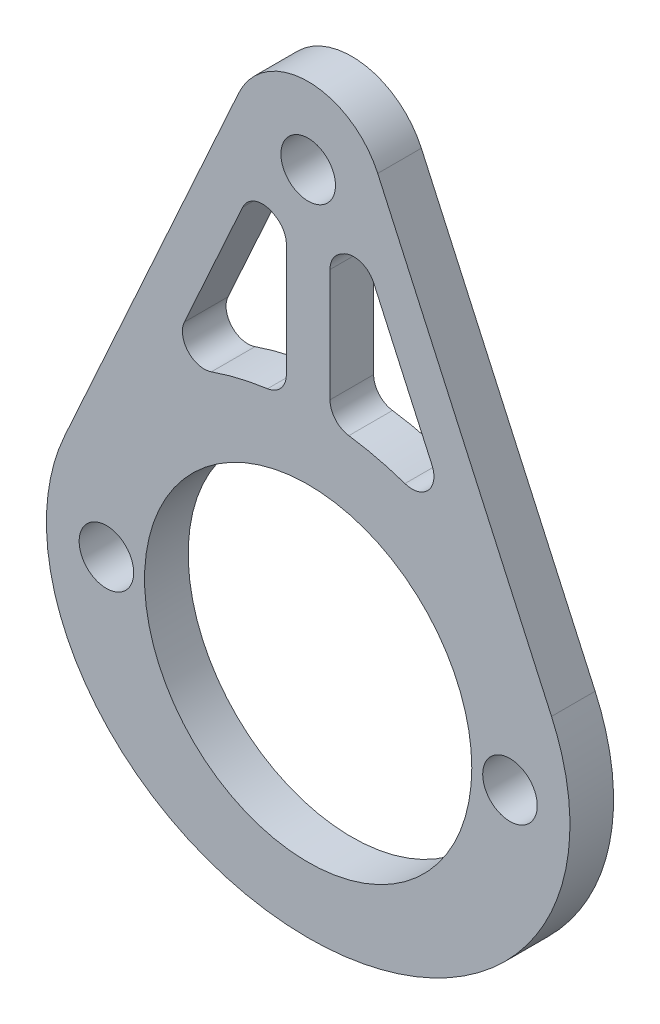
ISO-10303-21;
HEADER;
FILE_DESCRIPTION(('STEP AP214'),'2;1');
FILE_NAME('part.step','',(''),(''),'','','');
FILE_SCHEMA(('AUTOMOTIVE_DESIGN { 1 0 10303 214 1 1 1 1 }'));
ENDSEC;
DATA;
#1=APPLICATION_CONTEXT('core data for automotive mechanical design processes');
#2=APPLICATION_PROTOCOL_DEFINITION('international standard','automotive_design',2000,#1);
#3=PRODUCT_CONTEXT('',#1,'mechanical');
#4=PRODUCT('Part','Part','',(#3));
#5=PRODUCT_RELATED_PRODUCT_CATEGORY('part','',(#4));
#6=PRODUCT_DEFINITION_FORMATION('','',#4);
#7=PRODUCT_DEFINITION_CONTEXT('part definition',#1,'design');
#8=PRODUCT_DEFINITION('design','',#6,#7);
#9=PRODUCT_DEFINITION_SHAPE('','',#8);
#10=(LENGTH_UNIT() NAMED_UNIT(*) SI_UNIT(.MILLI.,.METRE.));
#11=(NAMED_UNIT(*) PLANE_ANGLE_UNIT() SI_UNIT($,.RADIAN.));
#12=(NAMED_UNIT(*) SI_UNIT($,.STERADIAN.) SOLID_ANGLE_UNIT());
#13=UNCERTAINTY_MEASURE_WITH_UNIT(LENGTH_MEASURE(1.E-05),#10,'distance_accuracy_value','');
#14=(GEOMETRIC_REPRESENTATION_CONTEXT(3) GLOBAL_UNCERTAINTY_ASSIGNED_CONTEXT((#13)) GLOBAL_UNIT_ASSIGNED_CONTEXT((#10,
#11,#12)) REPRESENTATION_CONTEXT('',''));
#15=CARTESIAN_POINT('',(0.,0.,0.));
#16=DIRECTION('',(0.,0.,1.));
#17=DIRECTION('',(1.,0.,0.));
#18=AXIS2_PLACEMENT_3D('',#15,#16,#17);
#19=CARTESIAN_POINT('',(0.,0.,2.));
#20=DIRECTION('',(0.,0.,1.));
#21=DIRECTION('',(1.,0.,0.));
#22=AXIS2_PLACEMENT_3D('',#19,#20,#21);
#23=PLANE('',#22);
#24=CARTESIAN_POINT('',(0.,20.,2.));
#25=DIRECTION('',(0.,0.,1.));
#26=DIRECTION('',(1.,0.,0.));
#27=AXIS2_PLACEMENT_3D('',#24,#25,#26);
#28=CIRCLE('',#27,1.24999999999999);
#29=CARTESIAN_POINT('',(1.24999999999999,20.,2.));
#30=VERTEX_POINT('',#29);
#31=EDGE_CURVE('E593',#30,#30,#28,.T.);
#32=ORIENTED_EDGE('',*,*,#31,.F.);
#33=EDGE_LOOP('',(#32));
#34=FACE_BOUND('',#33,.T.);
#35=CARTESIAN_POINT('',(9.25,0.,2.));
#36=DIRECTION('',(0.,0.,-1.));
#37=DIRECTION('',(-1.,0.,0.));
#38=AXIS2_PLACEMENT_3D('',#35,#36,#37);
#39=CIRCLE('',#38,1.25);
#40=CARTESIAN_POINT('',(8.,0.,2.));
#41=VERTEX_POINT('',#40);
#42=EDGE_CURVE('E427',#41,#41,#39,.T.);
#43=ORIENTED_EDGE('',*,*,#42,.T.);
#44=EDGE_LOOP('',(#43));
#45=FACE_BOUND('',#44,.T.);
#46=CARTESIAN_POINT('',(-9.25,0.,2.));
#47=DIRECTION('',(0.,0.,-1.));
#48=DIRECTION('',(-1.,0.,0.));
#49=AXIS2_PLACEMENT_3D('',#46,#47,#48);
#50=CIRCLE('',#49,1.25);
#51=CARTESIAN_POINT('',(-10.5,0.,2.));
#52=VERTEX_POINT('',#51);
#53=EDGE_CURVE('E435',#52,#52,#50,.T.);
#54=ORIENTED_EDGE('',*,*,#53,.T.);
#55=EDGE_LOOP('',(#54));
#56=FACE_BOUND('',#55,.T.);
#57=CARTESIAN_POINT('',(0.,0.,2.));
#58=DIRECTION('',(0.,0.,1.));
#59=DIRECTION('',(1.,0.,0.));
#60=AXIS2_PLACEMENT_3D('',#57,#58,#59);
#61=ELLIPSE('',#60,12.,10.5);
#62=CARTESIAN_POINT('',(-11.1544812211182,3.87157083288387,2.));
#63=VERTEX_POINT('',#62);
#64=CARTESIAN_POINT('',(11.1544812211182,3.87157083288387,2.));
#65=VERTEX_POINT('',#64);
#66=EDGE_CURVE('E203',#63,#65,#61,.T.);
#67=ORIENTED_EDGE('',*,*,#66,.T.);
#68=DIRECTION('',(-0.412891006712625,0.910780443672258,0.));
#69=VECTOR('',#68,1.);
#70=CARTESIAN_POINT('',(11.1544812211182,3.87157083288387,2.));
#71=LINE('',#70,#69);
#72=CARTESIAN_POINT('',(3.18773155285294,21.4451185234942,2.));
#73=VERTEX_POINT('',#72);
#74=EDGE_CURVE('E191',#65,#73,#71,.T.);
#75=ORIENTED_EDGE('',*,*,#74,.T.);
#76=CARTESIAN_POINT('',(0.,20.,2.));
#77=DIRECTION('',(0.,0.,1.));
#78=DIRECTION('',(1.,0.,0.));
#79=AXIS2_PLACEMENT_3D('',#76,#77,#78);
#80=CIRCLE('',#79,3.50000000000004);
#81=CARTESIAN_POINT('',(-3.18773155285294,21.4451185234942,2.));
#82=VERTEX_POINT('',#81);
#83=EDGE_CURVE('E202',#73,#82,#80,.T.);
#84=ORIENTED_EDGE('',*,*,#83,.T.);
#85=DIRECTION('',(-0.412891006712625,-0.910780443672258,0.));
#86=VECTOR('',#85,1.);
#87=CARTESIAN_POINT('',(-11.1544812211182,3.87157083288387,2.));
#88=LINE('',#87,#86);
#89=EDGE_CURVE('E208',#82,#63,#88,.T.);
#90=ORIENTED_EDGE('',*,*,#89,.T.);
#91=EDGE_LOOP('',(#67,#75,#84,#90));
#92=FACE_BOUND('',#91,.T.);
#93=CARTESIAN_POINT('',(0.,0.,2.));
#94=DIRECTION('',(0.,0.,1.));
#95=DIRECTION('',(1.,0.,0.));
#96=AXIS2_PLACEMENT_3D('',#93,#94,#95);
#97=CIRCLE('',#96,7.5);
#98=CARTESIAN_POINT('',(7.5,0.,2.));
#99=VERTEX_POINT('',#98);
#100=EDGE_CURVE('E440',#99,#99,#97,.T.);
#101=ORIENTED_EDGE('',*,*,#100,.F.);
#102=EDGE_LOOP('',(#101));
#103=FACE_BOUND('',#102,.T.);
#104=DIRECTION('',(-0.412891006712625,0.910780443672258,0.));
#105=VECTOR('',#104,1.);
#106=CARTESIAN_POINT('',(8.88723175114862,4.02891617855225,2.));
#107=LINE('',#106,#105);
#108=CARTESIAN_POINT('',(5.67550372809147,11.1135439041219,2.));
#109=VERTEX_POINT('',#108);
#110=CARTESIAN_POINT('',(3.00478104901348,17.0047886806622,2.));
#111=VERTEX_POINT('',#110);
#112=EDGE_CURVE('E404',#109,#111,#107,.T.);
#113=ORIENTED_EDGE('',*,*,#112,.F.);
#114=CARTESIAN_POINT('',(4.7647232844192,10.7006528974093,2.));
#115=DIRECTION('',(0.,0.,1.));
#116=DIRECTION('',(1.,0.,0.));
#117=AXIS2_PLACEMENT_3D('',#114,#115,#116);
#118=CIRCLE('',#117,1.);
#119=CARTESIAN_POINT('',(4.43596026389106,9.75624044708196,2.));
#120=VERTEX_POINT('',#119);
#121=EDGE_CURVE('E68',#109,#120,#118,.F.);
#122=ORIENTED_EDGE('',*,*,#121,.T.);
#123=CARTESIAN_POINT('',(0.,0.,2.));
#124=DIRECTION('',(0.,0.,-1.));
#125=DIRECTION('',(1.,0.,0.));
#126=AXIS2_PLACEMENT_3D('',#123,#124,#125);
#127=ELLIPSE('',#126,12.,10.5);
#128=CARTESIAN_POINT('',(1.86371811392942,10.3725909739313,2.));
#129=VERTEX_POINT('',#128);
#130=EDGE_CURVE('E390',#129,#120,#127,.T.);
#131=ORIENTED_EDGE('',*,*,#130,.F.);
#132=CARTESIAN_POINT('',(2.00000000000001,11.3632610741811,2.));
#133=DIRECTION('',(0.,0.,1.));
#134=DIRECTION('',(1.,0.,0.));
#135=AXIS2_PLACEMENT_3D('',#132,#133,#134);
#136=CIRCLE('',#135,1.);
#137=CARTESIAN_POINT('',(1.,11.3632610741811,2.));
#138=VERTEX_POINT('',#137);
#139=EDGE_CURVE('E314',#129,#138,#136,.F.);
#140=ORIENTED_EDGE('',*,*,#139,.T.);
#141=DIRECTION('',(0.,1.,0.));
#142=VECTOR('',#141,1.);
#143=CARTESIAN_POINT('',(1.,0.,2.));
#144=LINE('',#143,#142);
#145=CARTESIAN_POINT('',(1.,16.5358983848622,2.));
#146=VERTEX_POINT('',#145);
#147=EDGE_CURVE('E394',#138,#146,#144,.T.);
#148=ORIENTED_EDGE('',*,*,#147,.T.);
#149=CARTESIAN_POINT('',(2.,16.5358983848622,2.));
#150=DIRECTION('',(0.,0.,1.));
#151=DIRECTION('',(1.,0.,0.));
#152=AXIS2_PLACEMENT_3D('',#149,#150,#151);
#153=CIRCLE('',#152,1.);
#154=CARTESIAN_POINT('',(1.5,17.4019237886467,2.));
#155=VERTEX_POINT('',#154);
#156=EDGE_CURVE('E308',#146,#155,#153,.F.);
#157=ORIENTED_EDGE('',*,*,#156,.T.);
#158=CARTESIAN_POINT('',(0.,20.,2.));
#159=DIRECTION('',(0.,0.,-1.));
#160=DIRECTION('',(-1.,0.,0.));
#161=AXIS2_PLACEMENT_3D('',#158,#159,#160);
#162=CIRCLE('',#161,3.);
#163=CARTESIAN_POINT('',(1.57050045400592,17.4439232554622,2.));
#164=VERTEX_POINT('',#163);
#165=EDGE_CURVE('E400',#164,#155,#162,.T.);
#166=ORIENTED_EDGE('',*,*,#165,.F.);
#167=CARTESIAN_POINT('',(2.09400060534122,16.5918976739495,2.));
#168=DIRECTION('',(0.,0.,1.));
#169=DIRECTION('',(1.,0.,0.));
#170=AXIS2_PLACEMENT_3D('',#167,#168,#169);
#171=CIRCLE('',#170,1.);
#172=EDGE_CURVE('E302',#164,#111,#171,.F.);
#173=ORIENTED_EDGE('',*,*,#172,.T.);
#174=EDGE_LOOP('',(#113,#122,#131,#140,#148,#157,#166,#173));
#175=FACE_BOUND('',#174,.T.);
#176=DIRECTION('',(0.,1.,0.));
#177=VECTOR('',#176,1.);
#178=CARTESIAN_POINT('',(-1.,0.,2.));
#179=LINE('',#178,#177);
#180=CARTESIAN_POINT('',(-1.,11.3632610741811,2.));
#181=VERTEX_POINT('',#180);
#182=CARTESIAN_POINT('',(-1.,16.5358983848622,2.));
#183=VERTEX_POINT('',#182);
#184=EDGE_CURVE('E349',#181,#183,#179,.T.);
#185=ORIENTED_EDGE('',*,*,#184,.F.);
#186=CARTESIAN_POINT('',(-2.,11.3632610741811,2.));
#187=DIRECTION('',(0.,0.,1.));
#188=DIRECTION('',(1.,0.,0.));
#189=AXIS2_PLACEMENT_3D('',#186,#187,#188);
#190=CIRCLE('',#189,1.);
#191=CARTESIAN_POINT('',(-1.86371811392942,10.3725909739313,2.));
#192=VERTEX_POINT('',#191);
#193=EDGE_CURVE('E11',#181,#192,#190,.F.);
#194=ORIENTED_EDGE('',*,*,#193,.T.);
#195=CARTESIAN_POINT('',(0.,0.,2.));
#196=DIRECTION('',(0.,0.,-1.));
#197=DIRECTION('',(1.,0.,0.));
#198=AXIS2_PLACEMENT_3D('',#195,#196,#197);
#199=ELLIPSE('',#198,12.,10.5);
#200=CARTESIAN_POINT('',(-4.43596026389106,9.75624044708197,2.));
#201=VERTEX_POINT('',#200);
#202=EDGE_CURVE('E341',#201,#192,#199,.T.);
#203=ORIENTED_EDGE('',*,*,#202,.F.);
#204=CARTESIAN_POINT('',(-4.7647232844192,10.7006528974093,2.));
#205=DIRECTION('',(0.,0.,1.));
#206=DIRECTION('',(1.,0.,0.));
#207=AXIS2_PLACEMENT_3D('',#204,#205,#206);
#208=CIRCLE('',#207,1.);
#209=CARTESIAN_POINT('',(-5.67550372809146,11.1135439041219,2.));
#210=VERTEX_POINT('',#209);
#211=EDGE_CURVE('E296',#201,#210,#208,.F.);
#212=ORIENTED_EDGE('',*,*,#211,.T.);
#213=DIRECTION('',(-0.412891006712625,-0.910780443672258,0.));
#214=VECTOR('',#213,1.);
#215=CARTESIAN_POINT('',(-8.88723175114862,4.02891617855225,2.));
#216=LINE('',#215,#214);
#217=CARTESIAN_POINT('',(-3.00478104901348,17.0047886806622,2.));
#218=VERTEX_POINT('',#217);
#219=EDGE_CURVE('E354',#218,#210,#216,.T.);
#220=ORIENTED_EDGE('',*,*,#219,.F.);
#221=CARTESIAN_POINT('',(-2.09400060534123,16.5918976739495,2.));
#222=DIRECTION('',(0.,0.,1.));
#223=DIRECTION('',(1.,0.,0.));
#224=AXIS2_PLACEMENT_3D('',#221,#222,#223);
#225=CIRCLE('',#224,1.);
#226=CARTESIAN_POINT('',(-1.57050045400592,17.4439232554622,2.));
#227=VERTEX_POINT('',#226);
#228=EDGE_CURVE('E290',#218,#227,#225,.F.);
#229=ORIENTED_EDGE('',*,*,#228,.T.);
#230=CARTESIAN_POINT('',(0.,20.,2.));
#231=DIRECTION('',(0.,0.,-1.));
#232=DIRECTION('',(-1.,0.,0.));
#233=AXIS2_PLACEMENT_3D('',#230,#231,#232);
#234=CIRCLE('',#233,3.);
#235=CARTESIAN_POINT('',(-1.5,17.4019237886467,2.));
#236=VERTEX_POINT('',#235);
#237=EDGE_CURVE('E359',#236,#227,#234,.T.);
#238=ORIENTED_EDGE('',*,*,#237,.F.);
#239=CARTESIAN_POINT('',(-2.,16.5358983848622,2.));
#240=DIRECTION('',(0.,0.,1.));
#241=DIRECTION('',(1.,0.,0.));
#242=AXIS2_PLACEMENT_3D('',#239,#240,#241);
#243=CIRCLE('',#242,1.);
#244=EDGE_CURVE('E284',#236,#183,#243,.F.);
#245=ORIENTED_EDGE('',*,*,#244,.T.);
#246=EDGE_LOOP('',(#185,#194,#203,#212,#220,#229,#238,#245));
#247=FACE_BOUND('',#246,.T.);
#248=ADVANCED_FACE('F52',(#34,#45,#56,#92,#103,#175,#247),#23,.T.);
#249=CARTESIAN_POINT('',(0.,0.,0.));
#250=DIRECTION('',(0.,0.,1.));
#251=DIRECTION('',(1.,0.,0.));
#252=AXIS2_PLACEMENT_3D('',#249,#250,#251);
#253=PLANE('',#252);
#254=CARTESIAN_POINT('',(0.,20.,0.));
#255=DIRECTION('',(0.,0.,1.));
#256=DIRECTION('',(1.,0.,0.));
#257=AXIS2_PLACEMENT_3D('',#254,#255,#256);
#258=CIRCLE('',#257,1.25);
#259=CARTESIAN_POINT('',(1.25,20.,0.));
#260=VERTEX_POINT('',#259);
#261=EDGE_CURVE('E363',#260,#260,#258,.T.);
#262=ORIENTED_EDGE('',*,*,#261,.T.);
#263=EDGE_LOOP('',(#262));
#264=FACE_BOUND('',#263,.T.);
#265=DIRECTION('',(0.,1.,0.));
#266=VECTOR('',#265,1.);
#267=CARTESIAN_POINT('',(1.,0.,0.));
#268=LINE('',#267,#266);
#269=CARTESIAN_POINT('',(1.,11.3632610741811,0.));
#270=VERTEX_POINT('',#269);
#271=CARTESIAN_POINT('',(1.,16.5358983848622,0.));
#272=VERTEX_POINT('',#271);
#273=EDGE_CURVE('E413',#270,#272,#268,.T.);
#274=ORIENTED_EDGE('',*,*,#273,.F.);
#275=CARTESIAN_POINT('',(2.00000000000001,11.3632610741811,0.));
#276=DIRECTION('',(0.,0.,1.));
#277=DIRECTION('',(1.,0.,0.));
#278=AXIS2_PLACEMENT_3D('',#275,#276,#277);
#279=CIRCLE('',#278,1.);
#280=CARTESIAN_POINT('',(1.86371811392942,10.3725909739313,0.));
#281=VERTEX_POINT('',#280);
#282=EDGE_CURVE('E311',#270,#281,#279,.T.);
#283=ORIENTED_EDGE('',*,*,#282,.T.);
#284=CARTESIAN_POINT('',(0.,0.,0.));
#285=DIRECTION('',(0.,0.,-1.));
#286=DIRECTION('',(1.,0.,0.));
#287=AXIS2_PLACEMENT_3D('',#284,#285,#286);
#288=ELLIPSE('',#287,12.,10.5);
#289=CARTESIAN_POINT('',(4.43596026389106,9.75624044708196,0.));
#290=VERTEX_POINT('',#289);
#291=EDGE_CURVE('E409',#281,#290,#288,.T.);
#292=ORIENTED_EDGE('',*,*,#291,.T.);
#293=CARTESIAN_POINT('',(4.7647232844192,10.7006528974093,0.));
#294=DIRECTION('',(0.,0.,1.));
#295=DIRECTION('',(1.,0.,0.));
#296=AXIS2_PLACEMENT_3D('',#293,#294,#295);
#297=CIRCLE('',#296,1.);
#298=CARTESIAN_POINT('',(5.67550372809147,11.1135439041219,0.));
#299=VERTEX_POINT('',#298);
#300=EDGE_CURVE('E317',#290,#299,#297,.T.);
#301=ORIENTED_EDGE('',*,*,#300,.T.);
#302=DIRECTION('',(-0.412891006712625,0.910780443672258,0.));
#303=VECTOR('',#302,1.);
#304=CARTESIAN_POINT('',(8.88723175114862,4.02891617855225,0.));
#305=LINE('',#304,#303);
#306=CARTESIAN_POINT('',(3.00478104901348,17.0047886806622,0.));
#307=VERTEX_POINT('',#306);
#308=EDGE_CURVE('E395',#299,#307,#305,.T.);
#309=ORIENTED_EDGE('',*,*,#308,.T.);
#310=CARTESIAN_POINT('',(2.09400060534122,16.5918976739495,0.));
#311=DIRECTION('',(0.,0.,1.));
#312=DIRECTION('',(1.,0.,0.));
#313=AXIS2_PLACEMENT_3D('',#310,#311,#312);
#314=CIRCLE('',#313,1.);
#315=CARTESIAN_POINT('',(1.57050045400592,17.4439232554622,0.));
#316=VERTEX_POINT('',#315);
#317=EDGE_CURVE('E299',#307,#316,#314,.T.);
#318=ORIENTED_EDGE('',*,*,#317,.T.);
#319=CARTESIAN_POINT('',(0.,20.,0.));
#320=DIRECTION('',(0.,0.,-1.));
#321=DIRECTION('',(-1.,0.,0.));
#322=AXIS2_PLACEMENT_3D('',#319,#320,#321);
#323=CIRCLE('',#322,3.);
#324=CARTESIAN_POINT('',(1.5,17.4019237886467,0.));
#325=VERTEX_POINT('',#324);
#326=EDGE_CURVE('E417',#316,#325,#323,.T.);
#327=ORIENTED_EDGE('',*,*,#326,.T.);
#328=CARTESIAN_POINT('',(2.,16.5358983848622,0.));
#329=DIRECTION('',(0.,0.,1.));
#330=DIRECTION('',(1.,0.,0.));
#331=AXIS2_PLACEMENT_3D('',#328,#329,#330);
#332=CIRCLE('',#331,1.);
#333=EDGE_CURVE('E305',#325,#272,#332,.T.);
#334=ORIENTED_EDGE('',*,*,#333,.T.);
#335=EDGE_LOOP('',(#274,#283,#292,#301,#309,#318,#327,#334));
#336=FACE_BOUND('',#335,.T.);
#337=CARTESIAN_POINT('',(9.25,0.,0.));
#338=DIRECTION('',(0.,0.,-1.));
#339=DIRECTION('',(-1.,0.,0.));
#340=AXIS2_PLACEMENT_3D('',#337,#338,#339);
#341=CIRCLE('',#340,1.24999999999999);
#342=CARTESIAN_POINT('',(8.00000000000001,0.,0.));
#343=VERTEX_POINT('',#342);
#344=EDGE_CURVE('E408',#343,#343,#341,.T.);
#345=ORIENTED_EDGE('',*,*,#344,.F.);
#346=EDGE_LOOP('',(#345));
#347=FACE_BOUND('',#346,.T.);
#348=CARTESIAN_POINT('',(-9.25,0.,0.));
#349=DIRECTION('',(0.,0.,-1.));
#350=DIRECTION('',(-1.,0.,0.));
#351=AXIS2_PLACEMENT_3D('',#348,#349,#350);
#352=CIRCLE('',#351,1.24999999999999);
#353=CARTESIAN_POINT('',(-10.5,0.,0.));
#354=VERTEX_POINT('',#353);
#355=EDGE_CURVE('E431',#354,#354,#352,.T.);
#356=ORIENTED_EDGE('',*,*,#355,.F.);
#357=EDGE_LOOP('',(#356));
#358=FACE_BOUND('',#357,.T.);
#359=CARTESIAN_POINT('',(0.,0.,0.));
#360=DIRECTION('',(0.,0.,1.));
#361=DIRECTION('',(1.,0.,0.));
#362=AXIS2_PLACEMENT_3D('',#359,#360,#361);
#363=ELLIPSE('',#362,12.,10.5);
#364=CARTESIAN_POINT('',(-11.1544812211182,3.87157083288387,0.));
#365=VERTEX_POINT('',#364);
#366=CARTESIAN_POINT('',(11.1544812211182,3.87157083288387,0.));
#367=VERTEX_POINT('',#366);
#368=EDGE_CURVE('E217',#365,#367,#363,.T.);
#369=ORIENTED_EDGE('',*,*,#368,.F.);
#370=DIRECTION('',(-0.412891006712625,-0.910780443672258,0.));
#371=VECTOR('',#370,1.);
#372=CARTESIAN_POINT('',(-11.1544812211182,3.87157083288387,0.));
#373=LINE('',#372,#371);
#374=CARTESIAN_POINT('',(-3.18773155285294,21.4451185234942,0.));
#375=VERTEX_POINT('',#374);
#376=EDGE_CURVE('E213',#375,#365,#373,.T.);
#377=ORIENTED_EDGE('',*,*,#376,.F.);
#378=CARTESIAN_POINT('',(0.,20.,0.));
#379=DIRECTION('',(0.,0.,1.));
#380=DIRECTION('',(1.,0.,0.));
#381=AXIS2_PLACEMENT_3D('',#378,#379,#380);
#382=CIRCLE('',#381,3.50000000000004);
#383=CARTESIAN_POINT('',(3.18773155285294,21.4451185234942,0.));
#384=VERTEX_POINT('',#383);
#385=EDGE_CURVE('E507',#384,#375,#382,.T.);
#386=ORIENTED_EDGE('',*,*,#385,.F.);
#387=DIRECTION('',(-0.412891006712625,0.910780443672258,0.));
#388=VECTOR('',#387,1.);
#389=CARTESIAN_POINT('',(11.1544812211182,3.87157083288387,0.));
#390=LINE('',#389,#388);
#391=EDGE_CURVE('E512',#367,#384,#390,.T.);
#392=ORIENTED_EDGE('',*,*,#391,.F.);
#393=EDGE_LOOP('',(#369,#377,#386,#392));
#394=FACE_BOUND('',#393,.T.);
#395=CARTESIAN_POINT('',(0.,0.,0.));
#396=DIRECTION('',(0.,0.,1.));
#397=DIRECTION('',(1.,0.,0.));
#398=AXIS2_PLACEMENT_3D('',#395,#396,#397);
#399=CIRCLE('',#398,7.5);
#400=CARTESIAN_POINT('',(7.5,0.,0.));
#401=VERTEX_POINT('',#400);
#402=EDGE_CURVE('E439',#401,#401,#399,.T.);
#403=ORIENTED_EDGE('',*,*,#402,.T.);
#404=EDGE_LOOP('',(#403));
#405=FACE_BOUND('',#404,.T.);
#406=DIRECTION('',(-0.412891006712625,-0.910780443672258,0.));
#407=VECTOR('',#406,1.);
#408=CARTESIAN_POINT('',(-8.88723175114862,4.02891617855225,0.));
#409=LINE('',#408,#407);
#410=CARTESIAN_POINT('',(-3.00478104901348,17.0047886806622,0.));
#411=VERTEX_POINT('',#410);
#412=CARTESIAN_POINT('',(-5.67550372809146,11.1135439041219,0.));
#413=VERTEX_POINT('',#412);
#414=EDGE_CURVE('E561',#411,#413,#409,.T.);
#415=ORIENTED_EDGE('',*,*,#414,.T.);
#416=CARTESIAN_POINT('',(-4.7647232844192,10.7006528974093,0.));
#417=DIRECTION('',(0.,0.,1.));
#418=DIRECTION('',(1.,0.,0.));
#419=AXIS2_PLACEMENT_3D('',#416,#417,#418);
#420=CIRCLE('',#419,1.);
#421=CARTESIAN_POINT('',(-4.43596026389106,9.75624044708197,0.));
#422=VERTEX_POINT('',#421);
#423=EDGE_CURVE('E293',#413,#422,#420,.T.);
#424=ORIENTED_EDGE('',*,*,#423,.T.);
#425=CARTESIAN_POINT('',(0.,0.,0.));
#426=DIRECTION('',(0.,0.,-1.));
#427=DIRECTION('',(1.,0.,0.));
#428=AXIS2_PLACEMENT_3D('',#425,#426,#427);
#429=ELLIPSE('',#428,12.,10.5);
#430=CARTESIAN_POINT('',(-1.86371811392942,10.3725909739313,0.));
#431=VERTEX_POINT('',#430);
#432=EDGE_CURVE('E331',#422,#431,#429,.T.);
#433=ORIENTED_EDGE('',*,*,#432,.T.);
#434=CARTESIAN_POINT('',(-2.,11.3632610741811,0.));
#435=DIRECTION('',(0.,0.,1.));
#436=DIRECTION('',(1.,0.,0.));
#437=AXIS2_PLACEMENT_3D('',#434,#435,#436);
#438=CIRCLE('',#437,1.);
#439=CARTESIAN_POINT('',(-1.,11.3632610741811,0.));
#440=VERTEX_POINT('',#439);
#441=EDGE_CURVE('E61',#431,#440,#438,.T.);
#442=ORIENTED_EDGE('',*,*,#441,.T.);
#443=DIRECTION('',(0.,1.,0.));
#444=VECTOR('',#443,1.);
#445=CARTESIAN_POINT('',(-1.,0.,0.));
#446=LINE('',#445,#444);
#447=CARTESIAN_POINT('',(-1.,16.5358983848622,0.));
#448=VERTEX_POINT('',#447);
#449=EDGE_CURVE('E329',#440,#448,#446,.T.);
#450=ORIENTED_EDGE('',*,*,#449,.T.);
#451=CARTESIAN_POINT('',(-2.,16.5358983848622,0.));
#452=DIRECTION('',(0.,0.,1.));
#453=DIRECTION('',(1.,0.,0.));
#454=AXIS2_PLACEMENT_3D('',#451,#452,#453);
#455=CIRCLE('',#454,1.);
#456=CARTESIAN_POINT('',(-1.5,17.4019237886467,0.));
#457=VERTEX_POINT('',#456);
#458=EDGE_CURVE('E281',#448,#457,#455,.T.);
#459=ORIENTED_EDGE('',*,*,#458,.T.);
#460=CARTESIAN_POINT('',(0.,20.,0.));
#461=DIRECTION('',(0.,0.,-1.));
#462=DIRECTION('',(-1.,0.,0.));
#463=AXIS2_PLACEMENT_3D('',#460,#461,#462);
#464=CIRCLE('',#463,3.);
#465=CARTESIAN_POINT('',(-1.57050045400592,17.4439232554622,0.));
#466=VERTEX_POINT('',#465);
#467=EDGE_CURVE('E342',#457,#466,#464,.T.);
#468=ORIENTED_EDGE('',*,*,#467,.T.);
#469=CARTESIAN_POINT('',(-2.09400060534123,16.5918976739495,0.));
#470=DIRECTION('',(0.,0.,1.));
#471=DIRECTION('',(1.,0.,0.));
#472=AXIS2_PLACEMENT_3D('',#469,#470,#471);
#473=CIRCLE('',#472,1.);
#474=EDGE_CURVE('E287',#466,#411,#473,.T.);
#475=ORIENTED_EDGE('',*,*,#474,.T.);
#476=EDGE_LOOP('',(#415,#424,#433,#442,#450,#459,#468,#475));
#477=FACE_BOUND('',#476,.T.);
#478=ADVANCED_FACE('F328',(#264,#336,#347,#358,#394,#405,#477),#253,.F.);
#479=DIRECTION('',(0.,0.,-1.));
#480=VECTOR('',#479,1.);
#481=SURFACE_OF_LINEAR_EXTRUSION('',#61,#480);
#482=ORIENTED_EDGE('',*,*,#368,.T.);
#483=DIRECTION('',(0.,0.,-1.));
#484=VECTOR('',#483,1.);
#485=CARTESIAN_POINT('',(11.1544812211182,3.87157083288387,2.));
#486=LINE('',#485,#484);
#487=EDGE_CURVE('E195',#65,#367,#486,.T.);
#488=ORIENTED_EDGE('',*,*,#487,.F.);
#489=ORIENTED_EDGE('',*,*,#66,.F.);
#490=DIRECTION('',(0.,0.,-1.));
#491=VECTOR('',#490,1.);
#492=CARTESIAN_POINT('',(-11.1544812211182,3.87157083288387,2.));
#493=LINE('',#492,#491);
#494=EDGE_CURVE('E515',#63,#365,#493,.T.);
#495=ORIENTED_EDGE('',*,*,#494,.T.);
#496=EDGE_LOOP('',(#482,#488,#489,#495));
#497=FACE_BOUND('',#496,.T.);
#498=ADVANCED_FACE('F215',(#497),#481,.F.);
#499=CARTESIAN_POINT('',(11.1544812211182,3.87157083288387,2.));
#500=DIRECTION('',(-0.910780443672258,-0.412891006712625,0.));
#501=DIRECTION('',(0.412891006712625,-0.910780443672258,0.));
#502=AXIS2_PLACEMENT_3D('',#499,#500,#501);
#503=PLANE('',#502);
#504=ORIENTED_EDGE('',*,*,#391,.T.);
#505=DIRECTION('',(0.,0.,-1.));
#506=VECTOR('',#505,1.);
#507=CARTESIAN_POINT('',(3.18773155285294,21.4451185234942,2.));
#508=LINE('',#507,#506);
#509=EDGE_CURVE('E198',#73,#384,#508,.T.);
#510=ORIENTED_EDGE('',*,*,#509,.F.);
#511=ORIENTED_EDGE('',*,*,#74,.F.);
#512=ORIENTED_EDGE('',*,*,#487,.T.);
#513=EDGE_LOOP('',(#504,#510,#511,#512));
#514=FACE_BOUND('',#513,.T.);
#515=ADVANCED_FACE('F193',(#514),#503,.F.);
#516=CARTESIAN_POINT('',(0.,20.,2.));
#517=DIRECTION('',(0.,0.,-1.));
#518=DIRECTION('',(-1.,0.,0.));
#519=AXIS2_PLACEMENT_3D('',#516,#517,#518);
#520=CYLINDRICAL_SURFACE('',#519,3.50000000000004);
#521=ORIENTED_EDGE('',*,*,#385,.T.);
#522=DIRECTION('',(0.,0.,-1.));
#523=VECTOR('',#522,1.);
#524=CARTESIAN_POINT('',(-3.18773155285294,21.4451185234942,2.));
#525=LINE('',#524,#523);
#526=EDGE_CURVE('E226',#82,#375,#525,.T.);
#527=ORIENTED_EDGE('',*,*,#526,.F.);
#528=ORIENTED_EDGE('',*,*,#83,.F.);
#529=ORIENTED_EDGE('',*,*,#509,.T.);
#530=EDGE_LOOP('',(#521,#527,#528,#529));
#531=FACE_BOUND('',#530,.T.);
#532=ADVANCED_FACE('F498',(#531),#520,.T.);
#533=CARTESIAN_POINT('',(-11.1544812211182,3.87157083288387,2.));
#534=DIRECTION('',(0.910780443672258,-0.412891006712625,0.));
#535=DIRECTION('',(0.412891006712625,0.910780443672258,0.));
#536=AXIS2_PLACEMENT_3D('',#533,#534,#535);
#537=PLANE('',#536);
#538=ORIENTED_EDGE('',*,*,#376,.T.);
#539=ORIENTED_EDGE('',*,*,#494,.F.);
#540=ORIENTED_EDGE('',*,*,#89,.F.);
#541=ORIENTED_EDGE('',*,*,#526,.T.);
#542=EDGE_LOOP('',(#538,#539,#540,#541));
#543=FACE_BOUND('',#542,.T.);
#544=ADVANCED_FACE('F496',(#543),#537,.F.);
#545=CARTESIAN_POINT('',(0.,0.,2.));
#546=DIRECTION('',(0.,0.,-1.));
#547=DIRECTION('',(-1.,0.,0.));
#548=AXIS2_PLACEMENT_3D('',#545,#546,#547);
#549=CYLINDRICAL_SURFACE('',#548,7.5);
#550=ORIENTED_EDGE('',*,*,#100,.T.);
#551=EDGE_LOOP('',(#550));
#552=FACE_BOUND('',#551,.T.);
#553=ORIENTED_EDGE('',*,*,#402,.F.);
#554=EDGE_LOOP('',(#553));
#555=FACE_BOUND('',#554,.T.);
#556=ADVANCED_FACE('F494',(#552,#555),#549,.F.);
#557=CARTESIAN_POINT('',(-9.25,0.,0.));
#558=DIRECTION('',(0.,0.,-1.));
#559=DIRECTION('',(-1.,0.,0.));
#560=AXIS2_PLACEMENT_3D('',#557,#558,#559);
#561=CYLINDRICAL_SURFACE('',#560,1.24999999999999);
#562=ORIENTED_EDGE('',*,*,#53,.F.);
#563=EDGE_LOOP('',(#562));
#564=FACE_BOUND('',#563,.T.);
#565=ORIENTED_EDGE('',*,*,#355,.T.);
#566=EDGE_LOOP('',(#565));
#567=FACE_BOUND('',#566,.T.);
#568=ADVANCED_FACE('F605',(#564,#567),#561,.F.);
#569=CARTESIAN_POINT('',(9.25,0.,0.));
#570=DIRECTION('',(0.,0.,-1.));
#571=DIRECTION('',(-1.,0.,0.));
#572=AXIS2_PLACEMENT_3D('',#569,#570,#571);
#573=CYLINDRICAL_SURFACE('',#572,1.24999999999999);
#574=ORIENTED_EDGE('',*,*,#42,.F.);
#575=EDGE_LOOP('',(#574));
#576=FACE_BOUND('',#575,.T.);
#577=ORIENTED_EDGE('',*,*,#344,.T.);
#578=EDGE_LOOP('',(#577));
#579=FACE_BOUND('',#578,.T.);
#580=ADVANCED_FACE('F388',(#576,#579),#573,.F.);
#581=DIRECTION('',(0.,0.,-1.));
#582=VECTOR('',#581,1.);
#583=SURFACE_OF_LINEAR_EXTRUSION('',#127,#582);
#584=ORIENTED_EDGE('',*,*,#291,.F.);
#585=DIRECTION('',(0.,0.,-1.));
#586=VECTOR('',#585,1.);
#587=CARTESIAN_POINT('',(1.86371811392942,10.3725909739313,0.));
#588=LINE('',#587,#586);
#589=EDGE_CURVE('E75',#281,#129,#588,.F.);
#590=ORIENTED_EDGE('',*,*,#589,.T.);
#591=ORIENTED_EDGE('',*,*,#130,.T.);
#592=DIRECTION('',(0.,0.,-1.));
#593=VECTOR('',#592,1.);
#594=CARTESIAN_POINT('',(4.43596026389106,9.75624044708196,2.));
#595=LINE('',#594,#593);
#596=EDGE_CURVE('E275',#120,#290,#595,.T.);
#597=ORIENTED_EDGE('',*,*,#596,.T.);
#598=EDGE_LOOP('',(#584,#590,#591,#597));
#599=FACE_BOUND('',#598,.T.);
#600=ADVANCED_FACE('F377',(#599),#583,.T.);
#601=CARTESIAN_POINT('',(8.88723175114862,4.02891617855225,2.));
#602=DIRECTION('',(-0.910780443672258,-0.412891006712625,0.));
#603=DIRECTION('',(0.412891006712625,-0.910780443672258,0.));
#604=AXIS2_PLACEMENT_3D('',#601,#602,#603);
#605=PLANE('',#604);
#606=ORIENTED_EDGE('',*,*,#112,.T.);
#607=DIRECTION('',(0.,0.,1.));
#608=VECTOR('',#607,1.);
#609=CARTESIAN_POINT('',(3.00478104901348,17.0047886806622,0.));
#610=LINE('',#609,#608);
#611=EDGE_CURVE('E257',#111,#307,#610,.F.);
#612=ORIENTED_EDGE('',*,*,#611,.T.);
#613=ORIENTED_EDGE('',*,*,#308,.F.);
#614=DIRECTION('',(0.,0.,1.));
#615=VECTOR('',#614,1.);
#616=CARTESIAN_POINT('',(5.67550372809147,11.1135439041219,2.));
#617=LINE('',#616,#615);
#618=EDGE_CURVE('E254',#299,#109,#617,.T.);
#619=ORIENTED_EDGE('',*,*,#618,.T.);
#620=EDGE_LOOP('',(#606,#612,#613,#619));
#621=FACE_BOUND('',#620,.T.);
#622=ADVANCED_FACE('F373',(#621),#605,.T.);
#623=CARTESIAN_POINT('',(0.,20.,2.));
#624=DIRECTION('',(0.,0.,-1.));
#625=DIRECTION('',(-1.,0.,0.));
#626=AXIS2_PLACEMENT_3D('',#623,#624,#625);
#627=CYLINDRICAL_SURFACE('',#626,3.);
#628=ORIENTED_EDGE('',*,*,#326,.F.);
#629=DIRECTION('',(0.,0.,-1.));
#630=VECTOR('',#629,1.);
#631=CARTESIAN_POINT('',(1.57050045400592,17.4439232554622,2.));
#632=LINE('',#631,#630);
#633=EDGE_CURVE('E265',#316,#164,#632,.F.);
#634=ORIENTED_EDGE('',*,*,#633,.T.);
#635=ORIENTED_EDGE('',*,*,#165,.T.);
#636=DIRECTION('',(0.,0.,-1.));
#637=VECTOR('',#636,1.);
#638=CARTESIAN_POINT('',(1.5,17.4019237886467,2.));
#639=LINE('',#638,#637);
#640=EDGE_CURVE('E261',#155,#325,#639,.T.);
#641=ORIENTED_EDGE('',*,*,#640,.T.);
#642=EDGE_LOOP('',(#628,#634,#635,#641));
#643=FACE_BOUND('',#642,.T.);
#644=ADVANCED_FACE('F376',(#643),#627,.T.);
#645=CARTESIAN_POINT('',(1.,0.,2.));
#646=DIRECTION('',(-1.,0.,0.));
#647=DIRECTION('',(0.,-1.,0.));
#648=AXIS2_PLACEMENT_3D('',#645,#646,#647);
#649=PLANE('',#648);
#650=ORIENTED_EDGE('',*,*,#273,.T.);
#651=DIRECTION('',(0.,0.,-1.));
#652=VECTOR('',#651,1.);
#653=CARTESIAN_POINT('',(1.,16.5358983848622,2.));
#654=LINE('',#653,#652);
#655=EDGE_CURVE('E272',#272,#146,#654,.F.);
#656=ORIENTED_EDGE('',*,*,#655,.T.);
#657=ORIENTED_EDGE('',*,*,#147,.F.);
#658=DIRECTION('',(0.,0.,-1.));
#659=VECTOR('',#658,1.);
#660=CARTESIAN_POINT('',(1.,11.3632610741811,2.));
#661=LINE('',#660,#659);
#662=EDGE_CURVE('E268',#138,#270,#661,.T.);
#663=ORIENTED_EDGE('',*,*,#662,.T.);
#664=EDGE_LOOP('',(#650,#656,#657,#663));
#665=FACE_BOUND('',#664,.T.);
#666=ADVANCED_FACE('F370',(#665),#649,.F.);
#667=DIRECTION('',(0.,0.,-1.));
#668=VECTOR('',#667,1.);
#669=SURFACE_OF_LINEAR_EXTRUSION('',#199,#668);
#670=ORIENTED_EDGE('',*,*,#432,.F.);
#671=DIRECTION('',(0.,0.,-1.));
#672=VECTOR('',#671,1.);
#673=CARTESIAN_POINT('',(-4.43596026389106,9.75624044708197,0.));
#674=LINE('',#673,#672);
#675=EDGE_CURVE('E251',#422,#201,#674,.F.);
#676=ORIENTED_EDGE('',*,*,#675,.T.);
#677=ORIENTED_EDGE('',*,*,#202,.T.);
#678=DIRECTION('',(0.,0.,-1.));
#679=VECTOR('',#678,1.);
#680=CARTESIAN_POINT('',(-1.86371811392942,10.3725909739313,2.));
#681=LINE('',#680,#679);
#682=EDGE_CURVE('E247',#192,#431,#681,.T.);
#683=ORIENTED_EDGE('',*,*,#682,.T.);
#684=EDGE_LOOP('',(#670,#676,#677,#683));
#685=FACE_BOUND('',#684,.T.);
#686=ADVANCED_FACE('F351',(#685),#669,.T.);
#687=CARTESIAN_POINT('',(-1.,0.,2.));
#688=DIRECTION('',(-1.,0.,0.));
#689=DIRECTION('',(0.,0.,1.));
#690=AXIS2_PLACEMENT_3D('',#687,#688,#689);
#691=PLANE('',#690);
#692=ORIENTED_EDGE('',*,*,#184,.T.);
#693=DIRECTION('',(0.,0.,1.));
#694=VECTOR('',#693,1.);
#695=CARTESIAN_POINT('',(-1.,16.5358983848622,0.));
#696=LINE('',#695,#694);
#697=EDGE_CURVE('E224',#183,#448,#696,.F.);
#698=ORIENTED_EDGE('',*,*,#697,.T.);
#699=ORIENTED_EDGE('',*,*,#449,.F.);
#700=DIRECTION('',(0.,0.,1.));
#701=VECTOR('',#700,1.);
#702=CARTESIAN_POINT('',(-1.,11.3632610741811,2.));
#703=LINE('',#702,#701);
#704=EDGE_CURVE('E219',#440,#181,#703,.T.);
#705=ORIENTED_EDGE('',*,*,#704,.T.);
#706=EDGE_LOOP('',(#692,#698,#699,#705));
#707=FACE_BOUND('',#706,.T.);
#708=ADVANCED_FACE('F337',(#707),#691,.T.);
#709=CARTESIAN_POINT('',(0.,20.,2.));
#710=DIRECTION('',(0.,0.,-1.));
#711=DIRECTION('',(-1.,0.,0.));
#712=AXIS2_PLACEMENT_3D('',#709,#710,#711);
#713=CYLINDRICAL_SURFACE('',#712,3.);
#714=ORIENTED_EDGE('',*,*,#467,.F.);
#715=DIRECTION('',(0.,0.,-1.));
#716=VECTOR('',#715,1.);
#717=CARTESIAN_POINT('',(-1.5,17.4019237886467,2.));
#718=LINE('',#717,#716);
#719=EDGE_CURVE('E237',#457,#236,#718,.F.);
#720=ORIENTED_EDGE('',*,*,#719,.T.);
#721=ORIENTED_EDGE('',*,*,#237,.T.);
#722=DIRECTION('',(0.,0.,-1.));
#723=VECTOR('',#722,1.);
#724=CARTESIAN_POINT('',(-1.57050045400592,17.4439232554622,2.));
#725=LINE('',#724,#723);
#726=EDGE_CURVE('E233',#227,#466,#725,.T.);
#727=ORIENTED_EDGE('',*,*,#726,.T.);
#728=EDGE_LOOP('',(#714,#720,#721,#727));
#729=FACE_BOUND('',#728,.T.);
#730=ADVANCED_FACE('F569',(#729),#713,.T.);
#731=CARTESIAN_POINT('',(-8.88723175114862,4.02891617855225,2.));
#732=DIRECTION('',(0.910780443672258,-0.412891006712625,0.));
#733=DIRECTION('',(0.412891006712625,0.910780443672258,0.));
#734=AXIS2_PLACEMENT_3D('',#731,#732,#733);
#735=PLANE('',#734);
#736=ORIENTED_EDGE('',*,*,#414,.F.);
#737=DIRECTION('',(0.,0.,1.));
#738=VECTOR('',#737,1.);
#739=CARTESIAN_POINT('',(-3.00478104901348,17.0047886806622,2.));
#740=LINE('',#739,#738);
#741=EDGE_CURVE('E244',#411,#218,#740,.T.);
#742=ORIENTED_EDGE('',*,*,#741,.T.);
#743=ORIENTED_EDGE('',*,*,#219,.T.);
#744=DIRECTION('',(0.,0.,1.));
#745=VECTOR('',#744,1.);
#746=CARTESIAN_POINT('',(-5.67550372809146,11.1135439041219,0.));
#747=LINE('',#746,#745);
#748=EDGE_CURVE('E240',#210,#413,#747,.F.);
#749=ORIENTED_EDGE('',*,*,#748,.T.);
#750=EDGE_LOOP('',(#736,#742,#743,#749));
#751=FACE_BOUND('',#750,.T.);
#752=ADVANCED_FACE('F371',(#751),#735,.T.);
#753=CARTESIAN_POINT('',(-2.,16.5358983848622,2.));
#754=DIRECTION('',(0.,0.,-1.));
#755=DIRECTION('',(-1.,0.,0.));
#756=AXIS2_PLACEMENT_3D('',#753,#754,#755);
#757=CYLINDRICAL_SURFACE('',#756,1.);
#758=ORIENTED_EDGE('',*,*,#244,.F.);
#759=ORIENTED_EDGE('',*,*,#719,.F.);
#760=ORIENTED_EDGE('',*,*,#458,.F.);
#761=ORIENTED_EDGE('',*,*,#697,.F.);
#762=EDGE_LOOP('',(#758,#759,#760,#761));
#763=FACE_BOUND('',#762,.T.);
#764=ADVANCED_FACE('F453',(#763),#757,.F.);
#765=CARTESIAN_POINT('',(-2.09400060534123,16.5918976739495,2.));
#766=DIRECTION('',(0.,0.,-1.));
#767=DIRECTION('',(-1.,0.,0.));
#768=AXIS2_PLACEMENT_3D('',#765,#766,#767);
#769=CYLINDRICAL_SURFACE('',#768,1.);
#770=ORIENTED_EDGE('',*,*,#228,.F.);
#771=ORIENTED_EDGE('',*,*,#741,.F.);
#772=ORIENTED_EDGE('',*,*,#474,.F.);
#773=ORIENTED_EDGE('',*,*,#726,.F.);
#774=EDGE_LOOP('',(#770,#771,#772,#773));
#775=FACE_BOUND('',#774,.T.);
#776=ADVANCED_FACE('F456',(#775),#769,.F.);
#777=CARTESIAN_POINT('',(-4.7647232844192,10.7006528974093,1.));
#778=DIRECTION('',(0.,0.,-1.));
#779=DIRECTION('',(-1.,0.,0.));
#780=AXIS2_PLACEMENT_3D('',#777,#778,#779);
#781=CYLINDRICAL_SURFACE('',#780,1.);
#782=ORIENTED_EDGE('',*,*,#211,.F.);
#783=ORIENTED_EDGE('',*,*,#675,.F.);
#784=ORIENTED_EDGE('',*,*,#423,.F.);
#785=ORIENTED_EDGE('',*,*,#748,.F.);
#786=EDGE_LOOP('',(#782,#783,#784,#785));
#787=FACE_BOUND('',#786,.T.);
#788=ADVANCED_FACE('F460',(#787),#781,.F.);
#789=CARTESIAN_POINT('',(2.09400060534122,16.5918976739495,2.));
#790=DIRECTION('',(0.,0.,-1.));
#791=DIRECTION('',(-1.,0.,0.));
#792=AXIS2_PLACEMENT_3D('',#789,#790,#791);
#793=CYLINDRICAL_SURFACE('',#792,1.);
#794=ORIENTED_EDGE('',*,*,#172,.F.);
#795=ORIENTED_EDGE('',*,*,#633,.F.);
#796=ORIENTED_EDGE('',*,*,#317,.F.);
#797=ORIENTED_EDGE('',*,*,#611,.F.);
#798=EDGE_LOOP('',(#794,#795,#796,#797));
#799=FACE_BOUND('',#798,.T.);
#800=ADVANCED_FACE('F464',(#799),#793,.F.);
#801=CARTESIAN_POINT('',(2.,16.5358983848622,2.));
#802=DIRECTION('',(0.,0.,-1.));
#803=DIRECTION('',(-1.,0.,0.));
#804=AXIS2_PLACEMENT_3D('',#801,#802,#803);
#805=CYLINDRICAL_SURFACE('',#804,1.);
#806=ORIENTED_EDGE('',*,*,#156,.F.);
#807=ORIENTED_EDGE('',*,*,#655,.F.);
#808=ORIENTED_EDGE('',*,*,#333,.F.);
#809=ORIENTED_EDGE('',*,*,#640,.F.);
#810=EDGE_LOOP('',(#806,#807,#808,#809));
#811=FACE_BOUND('',#810,.T.);
#812=ADVANCED_FACE('F468',(#811),#805,.F.);
#813=CARTESIAN_POINT('',(2.00000000000001,11.3632610741811,1.));
#814=DIRECTION('',(0.,0.,-1.));
#815=DIRECTION('',(-1.,0.,0.));
#816=AXIS2_PLACEMENT_3D('',#813,#814,#815);
#817=CYLINDRICAL_SURFACE('',#816,1.);
#818=ORIENTED_EDGE('',*,*,#139,.F.);
#819=ORIENTED_EDGE('',*,*,#589,.F.);
#820=ORIENTED_EDGE('',*,*,#282,.F.);
#821=ORIENTED_EDGE('',*,*,#662,.F.);
#822=EDGE_LOOP('',(#818,#819,#820,#821));
#823=FACE_BOUND('',#822,.T.);
#824=ADVANCED_FACE('F472',(#823),#817,.F.);
#825=CARTESIAN_POINT('',(4.7647232844192,10.7006528974093,1.));
#826=DIRECTION('',(0.,0.,-1.));
#827=DIRECTION('',(-1.,0.,0.));
#828=AXIS2_PLACEMENT_3D('',#825,#826,#827);
#829=CYLINDRICAL_SURFACE('',#828,1.);
#830=ORIENTED_EDGE('',*,*,#121,.F.);
#831=ORIENTED_EDGE('',*,*,#618,.F.);
#832=ORIENTED_EDGE('',*,*,#300,.F.);
#833=ORIENTED_EDGE('',*,*,#596,.F.);
#834=EDGE_LOOP('',(#830,#831,#832,#833));
#835=FACE_BOUND('',#834,.T.);
#836=ADVANCED_FACE('F475',(#835),#829,.F.);
#837=CARTESIAN_POINT('',(-2.,11.3632610741811,1.));
#838=DIRECTION('',(0.,0.,-1.));
#839=DIRECTION('',(-1.,0.,0.));
#840=AXIS2_PLACEMENT_3D('',#837,#838,#839);
#841=CYLINDRICAL_SURFACE('',#840,1.);
#842=ORIENTED_EDGE('',*,*,#193,.F.);
#843=ORIENTED_EDGE('',*,*,#704,.F.);
#844=ORIENTED_EDGE('',*,*,#441,.F.);
#845=ORIENTED_EDGE('',*,*,#682,.F.);
#846=EDGE_LOOP('',(#842,#843,#844,#845));
#847=FACE_BOUND('',#846,.T.);
#848=ADVANCED_FACE('F54',(#847),#841,.F.);
#849=CARTESIAN_POINT('',(0.,20.,2.));
#850=DIRECTION('',(0.,0.,1.));
#851=DIRECTION('',(1.,0.,0.));
#852=AXIS2_PLACEMENT_3D('',#849,#850,#851);
#853=CYLINDRICAL_SURFACE('',#852,1.24999999999999);
#854=ORIENTED_EDGE('',*,*,#261,.F.);
#855=EDGE_LOOP('',(#854));
#856=FACE_BOUND('',#855,.T.);
#857=ORIENTED_EDGE('',*,*,#31,.T.);
#858=EDGE_LOOP('',(#857));
#859=FACE_BOUND('',#858,.T.);
#860=ADVANCED_FACE('F482',(#856,#859),#853,.F.);
#861=CLOSED_SHELL('',(#248,#478,#498,#515,#532,#544,#556,#568,#580,#600,#622,#644,#666,#686,
#708,#730,#752,#764,#776,#788,#800,#812,#824,#836,#848,#860));
#862=MANIFOLD_SOLID_BREP('B2',#861);
#863=ADVANCED_BREP_SHAPE_REPRESENTATION('',(#18,#862),#14);
#864=SHAPE_DEFINITION_REPRESENTATION(#9,#863);
ENDSEC;
END-ISO-10303-21;
